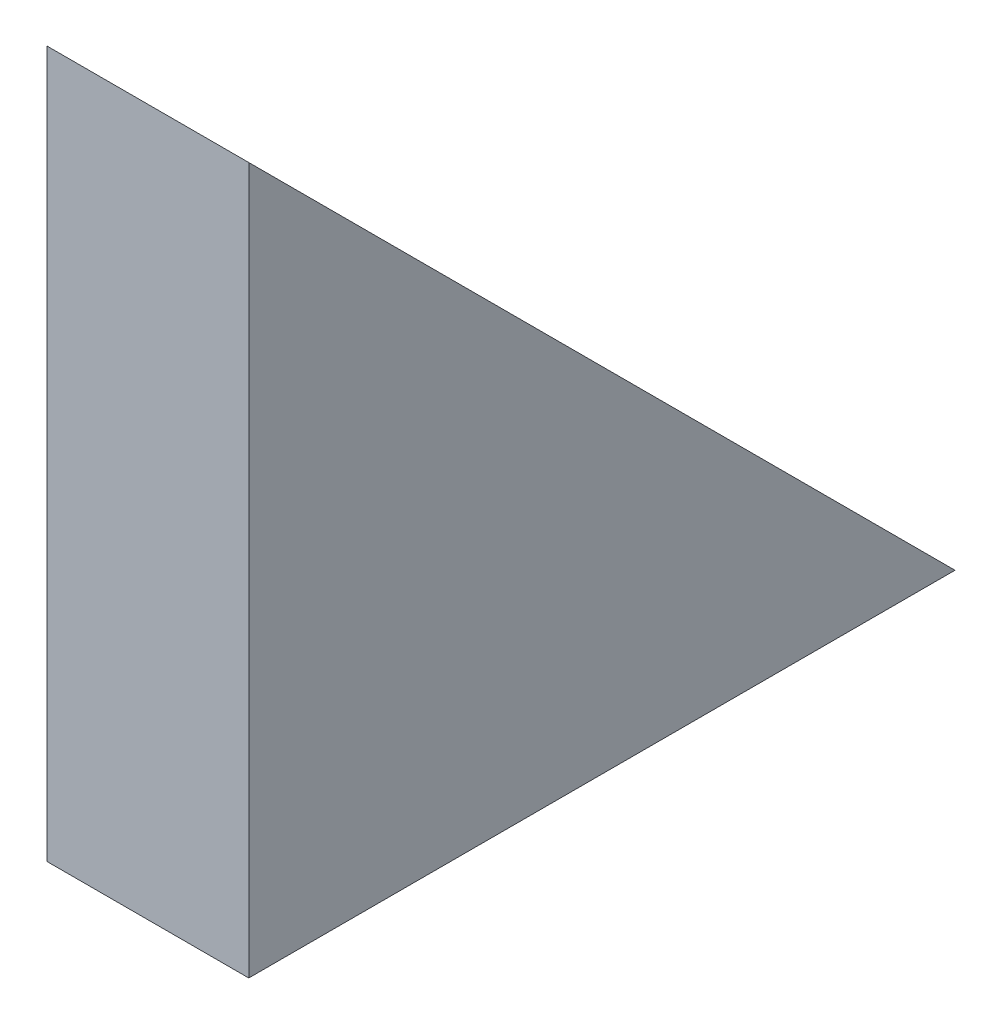
ISO-10303-21;
HEADER;
FILE_DESCRIPTION(('STEP AP214'),'2;1');
FILE_NAME('part.step','',(''),(''),'','','');
FILE_SCHEMA(('AUTOMOTIVE_DESIGN { 1 0 10303 214 1 1 1 1 }'));
ENDSEC;
DATA;
#1=APPLICATION_CONTEXT('core data for automotive mechanical design processes');
#2=APPLICATION_PROTOCOL_DEFINITION('international standard','automotive_design',2000,#1);
#3=PRODUCT_CONTEXT('',#1,'mechanical');
#4=PRODUCT('Part','Part','',(#3));
#5=PRODUCT_RELATED_PRODUCT_CATEGORY('part','',(#4));
#6=PRODUCT_DEFINITION_FORMATION('','',#4);
#7=PRODUCT_DEFINITION_CONTEXT('part definition',#1,'design');
#8=PRODUCT_DEFINITION('design','',#6,#7);
#9=PRODUCT_DEFINITION_SHAPE('','',#8);
#10=(LENGTH_UNIT() NAMED_UNIT(*) SI_UNIT(.MILLI.,.METRE.));
#11=(NAMED_UNIT(*) PLANE_ANGLE_UNIT() SI_UNIT($,.RADIAN.));
#12=(NAMED_UNIT(*) SI_UNIT($,.STERADIAN.) SOLID_ANGLE_UNIT());
#13=UNCERTAINTY_MEASURE_WITH_UNIT(LENGTH_MEASURE(1.E-05),#10,'distance_accuracy_value','');
#14=(GEOMETRIC_REPRESENTATION_CONTEXT(3) GLOBAL_UNCERTAINTY_ASSIGNED_CONTEXT((#13)) GLOBAL_UNIT_ASSIGNED_CONTEXT((#10,
#11,#12)) REPRESENTATION_CONTEXT('',''));
#15=CARTESIAN_POINT('',(0.,0.,0.));
#16=DIRECTION('',(0.,0.,1.));
#17=DIRECTION('',(1.,0.,0.));
#18=AXIS2_PLACEMENT_3D('',#15,#16,#17);
#19=CARTESIAN_POINT('',(10.,0.,-35.));
#20=DIRECTION('',(0.,-0.707106781186548,0.707106781186548));
#21=DIRECTION('',(0.,-0.707106781186548,-0.707106781186548));
#22=AXIS2_PLACEMENT_3D('',#19,#20,#21);
#23=PLANE('',#22);
#24=DIRECTION('',(0.,0.707106781186548,0.707106781186548));
#25=VECTOR('',#24,1.);
#26=CARTESIAN_POINT('',(0.,0.,-35.));
#27=LINE('',#26,#25);
#28=CARTESIAN_POINT('',(0.,0.,-35.));
#29=VERTEX_POINT('',#28);
#30=CARTESIAN_POINT('',(0.,35.,0.));
#31=VERTEX_POINT('',#30);
#32=EDGE_CURVE('E89',#29,#31,#27,.T.);
#33=ORIENTED_EDGE('',*,*,#32,.T.);
#34=DIRECTION('',(-1.,0.,0.));
#35=VECTOR('',#34,1.);
#36=CARTESIAN_POINT('',(10.,35.,0.));
#37=LINE('',#36,#35);
#38=CARTESIAN_POINT('',(10.,35.,0.));
#39=VERTEX_POINT('',#38);
#40=EDGE_CURVE('E11',#39,#31,#37,.T.);
#41=ORIENTED_EDGE('',*,*,#40,.F.);
#42=DIRECTION('',(0.,0.707106781186548,0.707106781186548));
#43=VECTOR('',#42,1.);
#44=CARTESIAN_POINT('',(10.,0.,-35.));
#45=LINE('',#44,#43);
#46=CARTESIAN_POINT('',(10.,0.,-35.));
#47=VERTEX_POINT('',#46);
#48=EDGE_CURVE('E81',#47,#39,#45,.T.);
#49=ORIENTED_EDGE('',*,*,#48,.F.);
#50=DIRECTION('',(-1.,0.,0.));
#51=VECTOR('',#50,1.);
#52=CARTESIAN_POINT('',(10.,0.,-35.));
#53=LINE('',#52,#51);
#54=EDGE_CURVE('E90',#47,#29,#53,.T.);
#55=ORIENTED_EDGE('',*,*,#54,.T.);
#56=EDGE_LOOP('',(#33,#41,#49,#55));
#57=FACE_BOUND('',#56,.T.);
#58=ADVANCED_FACE('F39',(#57),#23,.F.);
#59=CARTESIAN_POINT('',(10.,35.,0.));
#60=DIRECTION('',(0.,0.,-1.));
#61=DIRECTION('',(0.,1.,0.));
#62=AXIS2_PLACEMENT_3D('',#59,#60,#61);
#63=PLANE('',#62);
#64=DIRECTION('',(0.,-1.,0.));
#65=VECTOR('',#64,1.);
#66=CARTESIAN_POINT('',(0.,35.,0.));
#67=LINE('',#66,#65);
#68=CARTESIAN_POINT('',(0.,0.,0.));
#69=VERTEX_POINT('',#68);
#70=EDGE_CURVE('E68',#31,#69,#67,.T.);
#71=ORIENTED_EDGE('',*,*,#70,.T.);
#72=DIRECTION('',(-1.,0.,0.));
#73=VECTOR('',#72,1.);
#74=CARTESIAN_POINT('',(10.,0.,0.));
#75=LINE('',#74,#73);
#76=CARTESIAN_POINT('',(10.,0.,0.));
#77=VERTEX_POINT('',#76);
#78=EDGE_CURVE('E48',#77,#69,#75,.T.);
#79=ORIENTED_EDGE('',*,*,#78,.F.);
#80=DIRECTION('',(0.,-1.,0.));
#81=VECTOR('',#80,1.);
#82=CARTESIAN_POINT('',(10.,35.,0.));
#83=LINE('',#82,#81);
#84=EDGE_CURVE('E76',#39,#77,#83,.T.);
#85=ORIENTED_EDGE('',*,*,#84,.F.);
#86=ORIENTED_EDGE('',*,*,#40,.T.);
#87=EDGE_LOOP('',(#71,#79,#85,#86));
#88=FACE_BOUND('',#87,.T.);
#89=ADVANCED_FACE('F77',(#88),#63,.F.);
#90=CARTESIAN_POINT('',(10.,0.,0.));
#91=DIRECTION('',(0.,1.,0.));
#92=DIRECTION('',(0.,0.,1.));
#93=AXIS2_PLACEMENT_3D('',#90,#91,#92);
#94=PLANE('',#93);
#95=DIRECTION('',(0.,0.,-1.));
#96=VECTOR('',#95,1.);
#97=CARTESIAN_POINT('',(0.,0.,0.));
#98=LINE('',#97,#96);
#99=EDGE_CURVE('E73',#69,#29,#98,.T.);
#100=ORIENTED_EDGE('',*,*,#99,.T.);
#101=ORIENTED_EDGE('',*,*,#54,.F.);
#102=DIRECTION('',(0.,0.,-1.));
#103=VECTOR('',#102,1.);
#104=CARTESIAN_POINT('',(10.,0.,0.));
#105=LINE('',#104,#103);
#106=EDGE_CURVE('E56',#77,#47,#105,.T.);
#107=ORIENTED_EDGE('',*,*,#106,.F.);
#108=ORIENTED_EDGE('',*,*,#78,.T.);
#109=EDGE_LOOP('',(#100,#101,#107,#108));
#110=FACE_BOUND('',#109,.T.);
#111=ADVANCED_FACE('F102',(#110),#94,.F.);
#112=CARTESIAN_POINT('',(10.,0.,0.));
#113=DIRECTION('',(1.,0.,0.));
#114=DIRECTION('',(0.,0.,-1.));
#115=AXIS2_PLACEMENT_3D('',#112,#113,#114);
#116=PLANE('',#115);
#117=ORIENTED_EDGE('',*,*,#48,.T.);
#118=ORIENTED_EDGE('',*,*,#84,.T.);
#119=ORIENTED_EDGE('',*,*,#106,.T.);
#120=EDGE_LOOP('',(#117,#118,#119));
#121=FACE_BOUND('',#120,.T.);
#122=ADVANCED_FACE('F84',(#121),#116,.T.);
#123=CARTESIAN_POINT('',(0.,0.,0.));
#124=DIRECTION('',(1.,0.,0.));
#125=DIRECTION('',(0.,0.,-1.));
#126=AXIS2_PLACEMENT_3D('',#123,#124,#125);
#127=PLANE('',#126);
#128=ORIENTED_EDGE('',*,*,#32,.F.);
#129=ORIENTED_EDGE('',*,*,#99,.F.);
#130=ORIENTED_EDGE('',*,*,#70,.F.);
#131=EDGE_LOOP('',(#128,#129,#130));
#132=FACE_BOUND('',#131,.T.);
#133=ADVANCED_FACE('F103',(#132),#127,.F.);
#134=CLOSED_SHELL('',(#58,#89,#111,#122,#133));
#135=MANIFOLD_SOLID_BREP('B2',#134);
#136=ADVANCED_BREP_SHAPE_REPRESENTATION('',(#18,#135),#14);
#137=SHAPE_DEFINITION_REPRESENTATION(#9,#136);
ENDSEC;
END-ISO-10303-21;
